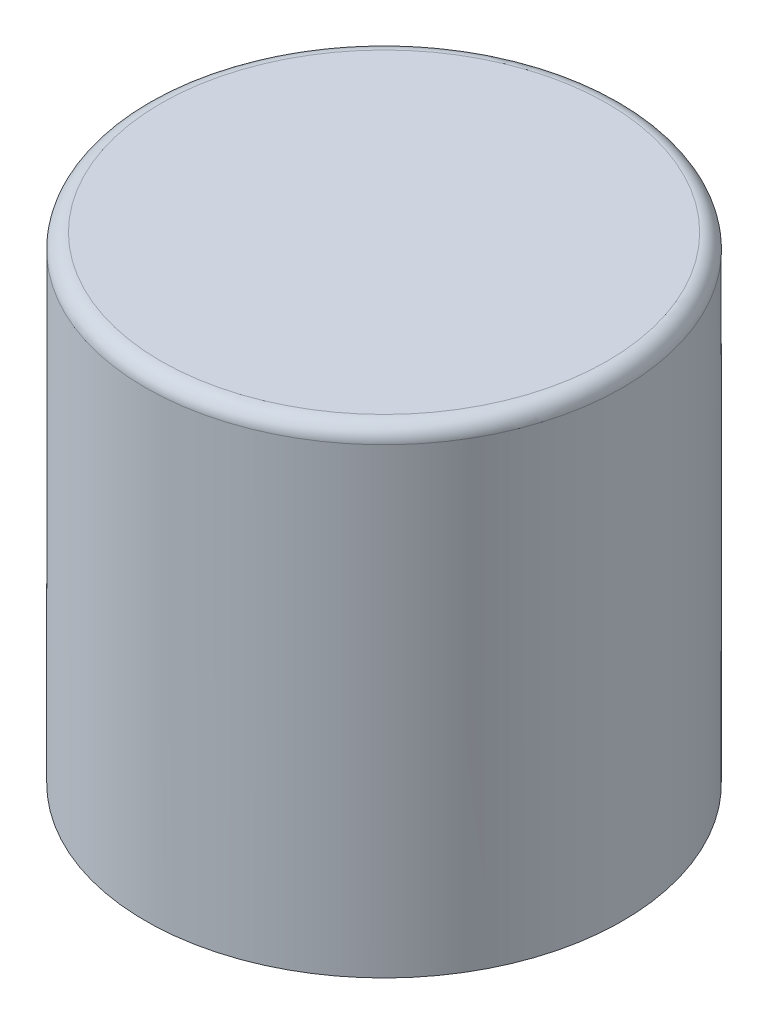
ISO-10303-21;
HEADER;
FILE_DESCRIPTION(('STEP AP214'),'2;1');
FILE_NAME('part.step','',(''),(''),'','','');
FILE_SCHEMA(('AUTOMOTIVE_DESIGN { 1 0 10303 214 1 1 1 1 }'));
ENDSEC;
DATA;
#1=APPLICATION_CONTEXT('core data for automotive mechanical design processes');
#2=APPLICATION_PROTOCOL_DEFINITION('international standard','automotive_design',2000,#1);
#3=PRODUCT_CONTEXT('',#1,'mechanical');
#4=PRODUCT('Part','Part','',(#3));
#5=PRODUCT_RELATED_PRODUCT_CATEGORY('part','',(#4));
#6=PRODUCT_DEFINITION_FORMATION('','',#4);
#7=PRODUCT_DEFINITION_CONTEXT('part definition',#1,'design');
#8=PRODUCT_DEFINITION('design','',#6,#7);
#9=PRODUCT_DEFINITION_SHAPE('','',#8);
#10=(LENGTH_UNIT() NAMED_UNIT(*) SI_UNIT(.MILLI.,.METRE.));
#11=(NAMED_UNIT(*) PLANE_ANGLE_UNIT() SI_UNIT($,.RADIAN.));
#12=(NAMED_UNIT(*) SI_UNIT($,.STERADIAN.) SOLID_ANGLE_UNIT());
#13=UNCERTAINTY_MEASURE_WITH_UNIT(LENGTH_MEASURE(1.E-05),#10,'distance_accuracy_value','');
#14=(GEOMETRIC_REPRESENTATION_CONTEXT(3) GLOBAL_UNCERTAINTY_ASSIGNED_CONTEXT((#13)) GLOBAL_UNIT_ASSIGNED_CONTEXT((#10,
#11,#12)) REPRESENTATION_CONTEXT('',''));
#15=CARTESIAN_POINT('',(0.,0.,0.));
#16=DIRECTION('',(0.,0.,1.));
#17=DIRECTION('',(1.,0.,0.));
#18=AXIS2_PLACEMENT_3D('',#15,#16,#17);
#19=CARTESIAN_POINT('',(0.,0.,0.));
#20=DIRECTION('',(0.,-1.,0.));
#21=DIRECTION('',(0.,0.,-1.));
#22=AXIS2_PLACEMENT_3D('',#19,#20,#21);
#23=PLANE('',#22);
#24=CARTESIAN_POINT('',(0.,0.,0.));
#25=DIRECTION('',(0.,-1.,0.));
#26=DIRECTION('',(0.,0.,-1.));
#27=AXIS2_PLACEMENT_3D('',#24,#25,#26);
#28=CIRCLE('',#27,15.748);
#29=CARTESIAN_POINT('',(0.,0.,-15.748));
#30=VERTEX_POINT('',#29);
#31=EDGE_CURVE('E31',#30,#30,#28,.T.);
#32=ORIENTED_EDGE('',*,*,#31,.T.);
#33=EDGE_LOOP('',(#32));
#34=FACE_BOUND('',#33,.T.);
#35=ADVANCED_FACE('F15',(#34),#23,.T.);
#36=CARTESIAN_POINT('',(0.,31.496,0.));
#37=DIRECTION('',(0.,1.,0.));
#38=DIRECTION('',(0.,0.,-1.));
#39=AXIS2_PLACEMENT_3D('',#36,#37,#38);
#40=CYLINDRICAL_SURFACE('',#39,15.748);
#41=ORIENTED_EDGE('',*,*,#31,.F.);
#42=EDGE_LOOP('',(#41));
#43=FACE_BOUND('',#42,.T.);
#44=CARTESIAN_POINT('',(0.,30.480000000254,0.));
#45=DIRECTION('',(0.,-1.,0.));
#46=DIRECTION('',(0.,0.,1.));
#47=AXIS2_PLACEMENT_3D('',#44,#45,#46);
#48=CIRCLE('',#47,15.748);
#49=CARTESIAN_POINT('',(0.,30.480000000254,15.748));
#50=VERTEX_POINT('',#49);
#51=EDGE_CURVE('E23',#50,#50,#48,.T.);
#52=ORIENTED_EDGE('',*,*,#51,.T.);
#53=EDGE_LOOP('',(#52));
#54=FACE_BOUND('',#53,.T.);
#55=ADVANCED_FACE('F44',(#43,#54),#40,.T.);
#56=CARTESIAN_POINT('',(0.,30.48,0.));
#57=DIRECTION('',(0.,1.,0.));
#58=DIRECTION('',(0.,0.,1.));
#59=AXIS2_PLACEMENT_3D('',#56,#57,#58);
#60=TOROIDAL_SURFACE('',#59,14.732,1.016);
#61=CARTESIAN_POINT('',(0.,31.496,0.));
#62=DIRECTION('',(0.,1.,0.));
#63=DIRECTION('',(0.,0.,1.));
#64=AXIS2_PLACEMENT_3D('',#61,#62,#63);
#65=CIRCLE('',#64,14.732);
#66=CARTESIAN_POINT('',(0.,31.496,14.732));
#67=VERTEX_POINT('',#66);
#68=EDGE_CURVE('E10',#67,#67,#65,.T.);
#69=ORIENTED_EDGE('',*,*,#68,.F.);
#70=EDGE_LOOP('',(#69));
#71=FACE_BOUND('',#70,.T.);
#72=ORIENTED_EDGE('',*,*,#51,.F.);
#73=EDGE_LOOP('',(#72));
#74=FACE_BOUND('',#73,.T.);
#75=ADVANCED_FACE('F46',(#71,#74),#60,.T.);
#76=CARTESIAN_POINT('',(0.,31.496,0.));
#77=DIRECTION('',(0.,1.,0.));
#78=DIRECTION('',(1.,0.,0.));
#79=AXIS2_PLACEMENT_3D('',#76,#77,#78);
#80=PLANE('',#79);
#81=ORIENTED_EDGE('',*,*,#68,.T.);
#82=EDGE_LOOP('',(#81));
#83=FACE_BOUND('',#82,.T.);
#84=ADVANCED_FACE('F17',(#83),#80,.T.);
#85=CLOSED_SHELL('',(#35,#55,#75,#84));
#86=MANIFOLD_SOLID_BREP('B1',#85);
#87=ADVANCED_BREP_SHAPE_REPRESENTATION('',(#18,#86),#14);
#88=SHAPE_DEFINITION_REPRESENTATION(#9,#87);
ENDSEC;
END-ISO-10303-21;
